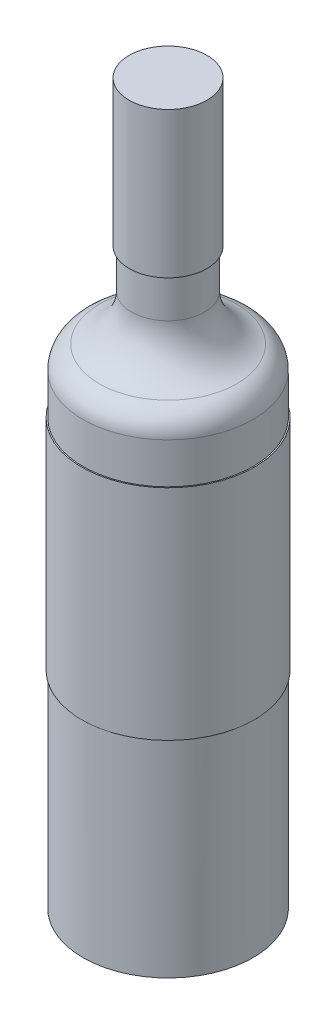
ISO-10303-21;
HEADER;
FILE_DESCRIPTION(('STEP AP214'),'2;1');
FILE_NAME('part.step','',(''),(''),'','','');
FILE_SCHEMA(('AUTOMOTIVE_DESIGN { 1 0 10303 214 1 1 1 1 }'));
ENDSEC;
DATA;
#1=APPLICATION_CONTEXT('core data for automotive mechanical design processes');
#2=APPLICATION_PROTOCOL_DEFINITION('international standard','automotive_design',2000,#1);
#3=PRODUCT_CONTEXT('',#1,'mechanical');
#4=PRODUCT('Part','Part','',(#3));
#5=PRODUCT_RELATED_PRODUCT_CATEGORY('part','',(#4));
#6=PRODUCT_DEFINITION_FORMATION('','',#4);
#7=PRODUCT_DEFINITION_CONTEXT('part definition',#1,'design');
#8=PRODUCT_DEFINITION('design','',#6,#7);
#9=PRODUCT_DEFINITION_SHAPE('','',#8);
#10=(LENGTH_UNIT() NAMED_UNIT(*) SI_UNIT(.MILLI.,.METRE.));
#11=(NAMED_UNIT(*) PLANE_ANGLE_UNIT() SI_UNIT($,.RADIAN.));
#12=(NAMED_UNIT(*) SI_UNIT($,.STERADIAN.) SOLID_ANGLE_UNIT());
#13=UNCERTAINTY_MEASURE_WITH_UNIT(LENGTH_MEASURE(1.E-05),#10,'distance_accuracy_value','');
#14=(GEOMETRIC_REPRESENTATION_CONTEXT(3) GLOBAL_UNCERTAINTY_ASSIGNED_CONTEXT((#13)) GLOBAL_UNIT_ASSIGNED_CONTEXT((#10,
#11,#12)) REPRESENTATION_CONTEXT('',''));
#15=CARTESIAN_POINT('',(0.,0.,0.));
#16=DIRECTION('',(0.,0.,1.));
#17=DIRECTION('',(1.,0.,0.));
#18=AXIS2_PLACEMENT_3D('',#15,#16,#17);
#19=CARTESIAN_POINT('',(0.,200.,0.));
#20=DIRECTION('',(0.,-1.,0.));
#21=DIRECTION('',(0.,0.,-1.));
#22=AXIS2_PLACEMENT_3D('',#19,#20,#21);
#23=CYLINDRICAL_SURFACE('',#22,35.);
#24=CARTESIAN_POINT('',(0.,191.715728752538,0.));
#25=DIRECTION('',(0.,-1.,0.));
#26=DIRECTION('',(0.,0.,-1.));
#27=AXIS2_PLACEMENT_3D('',#24,#25,#26);
#28=CIRCLE('',#27,35.);
#29=CARTESIAN_POINT('',(0.,191.715728752538,-35.));
#30=VERTEX_POINT('',#29);
#31=EDGE_CURVE('E42',#30,#30,#28,.T.);
#32=ORIENTED_EDGE('',*,*,#31,.T.);
#33=EDGE_LOOP('',(#32));
#34=FACE_BOUND('',#33,.T.);
#35=CARTESIAN_POINT('',(0.,175.,0.));
#36=DIRECTION('',(0.,-1.,0.));
#37=DIRECTION('',(0.,0.,-1.));
#38=AXIS2_PLACEMENT_3D('',#35,#36,#37);
#39=CIRCLE('',#38,35.);
#40=CARTESIAN_POINT('',(0.,175.,-35.));
#41=VERTEX_POINT('',#40);
#42=EDGE_CURVE('E10',#41,#41,#39,.T.);
#43=ORIENTED_EDGE('',*,*,#42,.F.);
#44=EDGE_LOOP('',(#43));
#45=FACE_BOUND('',#44,.T.);
#46=ADVANCED_FACE('F31',(#34,#45),#23,.T.);
#47=CARTESIAN_POINT('',(0.,295.,0.));
#48=DIRECTION('',(0.,-1.,0.));
#49=DIRECTION('',(0.,0.,-1.));
#50=AXIS2_PLACEMENT_3D('',#47,#48,#49);
#51=CYLINDRICAL_SURFACE('',#50,15.);
#52=CARTESIAN_POINT('',(0.,220.,0.));
#53=DIRECTION('',(0.,1.,0.));
#54=DIRECTION('',(0.,0.,1.));
#55=AXIS2_PLACEMENT_3D('',#52,#53,#54);
#56=CIRCLE('',#55,15.);
#57=CARTESIAN_POINT('',(0.,220.,15.));
#58=VERTEX_POINT('',#57);
#59=EDGE_CURVE('E72',#58,#58,#56,.T.);
#60=ORIENTED_EDGE('',*,*,#59,.T.);
#61=EDGE_LOOP('',(#60));
#62=FACE_BOUND('',#61,.T.);
#63=CARTESIAN_POINT('',(0.,236.,0.));
#64=DIRECTION('',(0.,1.,0.));
#65=DIRECTION('',(0.,0.,1.));
#66=AXIS2_PLACEMENT_3D('',#63,#64,#65);
#67=CIRCLE('',#66,15.);
#68=CARTESIAN_POINT('',(0.,236.,15.));
#69=VERTEX_POINT('',#68);
#70=EDGE_CURVE('E38',#69,#69,#67,.T.);
#71=ORIENTED_EDGE('',*,*,#70,.F.);
#72=EDGE_LOOP('',(#71));
#73=FACE_BOUND('',#72,.T.);
#74=ADVANCED_FACE('F90',(#62,#73),#51,.T.);
#75=CARTESIAN_POINT('',(0.,220.,0.));
#76=DIRECTION('',(0.,1.,0.));
#77=DIRECTION('',(0.,0.,1.));
#78=AXIS2_PLACEMENT_3D('',#75,#76,#77);
#79=TOROIDAL_SURFACE('',#78,35.,20.);
#80=CARTESIAN_POINT('',(0.,201.143819168359,0.));
#81=DIRECTION('',(0.,1.,0.));
#82=DIRECTION('',(0.,0.,1.));
#83=AXIS2_PLACEMENT_3D('',#80,#81,#82);
#84=CIRCLE('',#83,28.3333333333334);
#85=CARTESIAN_POINT('',(0.,201.143819168359,28.3333333333334));
#86=VERTEX_POINT('',#85);
#87=EDGE_CURVE('E47',#86,#86,#84,.T.);
#88=ORIENTED_EDGE('',*,*,#87,.T.);
#89=EDGE_LOOP('',(#88));
#90=FACE_BOUND('',#89,.T.);
#91=ORIENTED_EDGE('',*,*,#59,.F.);
#92=EDGE_LOOP('',(#91));
#93=FACE_BOUND('',#92,.T.);
#94=ADVANCED_FACE('F77',(#90,#93),#79,.F.);
#95=CARTESIAN_POINT('',(0.,191.715728752538,0.));
#96=DIRECTION('',(0.,-1.,0.));
#97=DIRECTION('',(0.,0.,-1.));
#98=AXIS2_PLACEMENT_3D('',#95,#96,#97);
#99=TOROIDAL_SURFACE('',#98,25.,10.);
#100=ORIENTED_EDGE('',*,*,#31,.F.);
#101=EDGE_LOOP('',(#100));
#102=FACE_BOUND('',#101,.T.);
#103=ORIENTED_EDGE('',*,*,#87,.F.);
#104=EDGE_LOOP('',(#103));
#105=FACE_BOUND('',#104,.T.);
#106=ADVANCED_FACE('F33',(#102,#105),#99,.T.);
#107=CARTESIAN_POINT('',(0.,236.,0.));
#108=DIRECTION('',(0.,1.,0.));
#109=DIRECTION('',(0.,0.,1.));
#110=AXIS2_PLACEMENT_3D('',#107,#108,#109);
#111=CYLINDRICAL_SURFACE('',#110,16.);
#112=CARTESIAN_POINT('',(0.,236.,0.));
#113=DIRECTION('',(0.,1.,0.));
#114=DIRECTION('',(0.,0.,1.));
#115=AXIS2_PLACEMENT_3D('',#112,#113,#114);
#116=CIRCLE('',#115,16.);
#117=CARTESIAN_POINT('',(0.,236.,16.));
#118=VERTEX_POINT('',#117);
#119=EDGE_CURVE('E57',#118,#118,#116,.T.);
#120=ORIENTED_EDGE('',*,*,#119,.T.);
#121=EDGE_LOOP('',(#120));
#122=FACE_BOUND('',#121,.T.);
#123=CARTESIAN_POINT('',(0.,296.,0.));
#124=DIRECTION('',(0.,1.,0.));
#125=DIRECTION('',(0.,0.,1.));
#126=AXIS2_PLACEMENT_3D('',#123,#124,#125);
#127=CIRCLE('',#126,16.);
#128=CARTESIAN_POINT('',(0.,296.,16.));
#129=VERTEX_POINT('',#128);
#130=EDGE_CURVE('E52',#129,#129,#127,.T.);
#131=ORIENTED_EDGE('',*,*,#130,.F.);
#132=EDGE_LOOP('',(#131));
#133=FACE_BOUND('',#132,.T.);
#134=ADVANCED_FACE('F81',(#122,#133),#111,.T.);
#135=CARTESIAN_POINT('',(0.,236.,0.));
#136=DIRECTION('',(0.,1.,0.));
#137=DIRECTION('',(0.,0.,1.));
#138=AXIS2_PLACEMENT_3D('',#135,#136,#137);
#139=PLANE('',#138);
#140=ORIENTED_EDGE('',*,*,#70,.T.);
#141=EDGE_LOOP('',(#140));
#142=FACE_BOUND('',#141,.T.);
#143=ORIENTED_EDGE('',*,*,#119,.F.);
#144=EDGE_LOOP('',(#143));
#145=FACE_BOUND('',#144,.T.);
#146=ADVANCED_FACE('F87',(#142,#145),#139,.F.);
#147=CARTESIAN_POINT('',(0.,296.,0.));
#148=DIRECTION('',(0.,1.,0.));
#149=DIRECTION('',(0.,0.,1.));
#150=AXIS2_PLACEMENT_3D('',#147,#148,#149);
#151=PLANE('',#150);
#152=ORIENTED_EDGE('',*,*,#130,.T.);
#153=EDGE_LOOP('',(#152));
#154=FACE_BOUND('',#153,.T.);
#155=ADVANCED_FACE('F119',(#154),#151,.T.);
#156=CARTESIAN_POINT('',(0.,175.,0.));
#157=DIRECTION('',(0.,-1.,0.));
#158=DIRECTION('',(0.,0.,-1.));
#159=AXIS2_PLACEMENT_3D('',#156,#157,#158);
#160=CYLINDRICAL_SURFACE('',#159,35.5);
#161=CARTESIAN_POINT('',(0.,175.,0.));
#162=DIRECTION('',(0.,-1.,0.));
#163=DIRECTION('',(0.,0.,-1.));
#164=AXIS2_PLACEMENT_3D('',#161,#162,#163);
#165=CIRCLE('',#164,35.5);
#166=CARTESIAN_POINT('',(0.,175.,-35.5));
#167=VERTEX_POINT('',#166);
#168=EDGE_CURVE('E53',#167,#167,#165,.T.);
#169=CARTESIAN_POINT('',(0.,85.,0.));
#170=DIRECTION('',(0.,-1.,0.));
#171=DIRECTION('',(0.,0.,-1.));
#172=AXIS2_PLACEMENT_3D('',#169,#170,#171);
#173=CIRCLE('',#172,35.5);
#174=CARTESIAN_POINT('',(0.,85.,-35.5));
#175=VERTEX_POINT('',#174);
#176=EDGE_CURVE('E60',#175,#175,#173,.T.);
#177=CARTESIAN_POINT('',(0.,175.,-35.5));
#178=CARTESIAN_POINT('',(0.,174.0625,-35.5));
#179=CARTESIAN_POINT('',(0.,173.125,-35.5));
#180=CARTESIAN_POINT('',(0.,171.25,-35.5));
#181=CARTESIAN_POINT('',(0.,170.3125,-35.5));
#182=CARTESIAN_POINT('',(0.,168.4375,-35.5));
#183=CARTESIAN_POINT('',(0.,167.5,-35.5));
#184=CARTESIAN_POINT('',(0.,165.625,-35.5));
#185=CARTESIAN_POINT('',(0.,164.6875,-35.5));
#186=CARTESIAN_POINT('',(0.,162.8125,-35.5));
#187=CARTESIAN_POINT('',(0.,161.875,-35.5));
#188=CARTESIAN_POINT('',(0.,160.,-35.5));
#189=CARTESIAN_POINT('',(0.,159.0625,-35.5));
#190=CARTESIAN_POINT('',(0.,157.1875,-35.5));
#191=CARTESIAN_POINT('',(0.,156.25,-35.5));
#192=CARTESIAN_POINT('',(0.,154.375,-35.5));
#193=CARTESIAN_POINT('',(0.,153.4375,-35.5));
#194=CARTESIAN_POINT('',(0.,151.5625,-35.5));
#195=CARTESIAN_POINT('',(0.,150.625,-35.5));
#196=CARTESIAN_POINT('',(0.,148.75,-35.5));
#197=CARTESIAN_POINT('',(0.,147.8125,-35.5));
#198=CARTESIAN_POINT('',(0.,145.9375,-35.5));
#199=CARTESIAN_POINT('',(0.,145.,-35.5));
#200=CARTESIAN_POINT('',(0.,143.125,-35.5));
#201=CARTESIAN_POINT('',(0.,142.1875,-35.5));
#202=CARTESIAN_POINT('',(0.,140.3125,-35.5));
#203=CARTESIAN_POINT('',(0.,139.375,-35.5));
#204=CARTESIAN_POINT('',(0.,137.5,-35.5));
#205=CARTESIAN_POINT('',(0.,136.5625,-35.5));
#206=CARTESIAN_POINT('',(0.,134.6875,-35.5));
#207=CARTESIAN_POINT('',(0.,133.75,-35.5));
#208=CARTESIAN_POINT('',(0.,131.875,-35.5));
#209=CARTESIAN_POINT('',(0.,130.9375,-35.5));
#210=CARTESIAN_POINT('',(0.,129.0625,-35.5));
#211=CARTESIAN_POINT('',(0.,128.125,-35.5));
#212=CARTESIAN_POINT('',(0.,126.25,-35.5));
#213=CARTESIAN_POINT('',(0.,125.3125,-35.5));
#214=CARTESIAN_POINT('',(0.,123.4375,-35.5));
#215=CARTESIAN_POINT('',(0.,122.5,-35.5));
#216=CARTESIAN_POINT('',(0.,120.625,-35.5));
#217=CARTESIAN_POINT('',(0.,119.6875,-35.5));
#218=CARTESIAN_POINT('',(0.,117.8125,-35.5));
#219=CARTESIAN_POINT('',(0.,116.875,-35.5));
#220=CARTESIAN_POINT('',(0.,115.,-35.5));
#221=CARTESIAN_POINT('',(0.,114.0625,-35.5));
#222=CARTESIAN_POINT('',(0.,112.1875,-35.5));
#223=CARTESIAN_POINT('',(0.,111.25,-35.5));
#224=CARTESIAN_POINT('',(0.,109.375,-35.5));
#225=CARTESIAN_POINT('',(0.,108.4375,-35.5));
#226=CARTESIAN_POINT('',(0.,106.5625,-35.5));
#227=CARTESIAN_POINT('',(0.,105.625,-35.5));
#228=CARTESIAN_POINT('',(0.,103.75,-35.5));
#229=CARTESIAN_POINT('',(0.,102.8125,-35.5));
#230=CARTESIAN_POINT('',(0.,100.9375,-35.5));
#231=CARTESIAN_POINT('',(0.,100.,-35.5));
#232=CARTESIAN_POINT('',(0.,98.125,-35.5));
#233=CARTESIAN_POINT('',(0.,97.1875,-35.5));
#234=CARTESIAN_POINT('',(0.,95.3125,-35.5));
#235=CARTESIAN_POINT('',(0.,94.375,-35.5));
#236=CARTESIAN_POINT('',(0.,92.5,-35.5));
#237=CARTESIAN_POINT('',(0.,91.5625,-35.5));
#238=CARTESIAN_POINT('',(0.,89.6875,-35.5));
#239=CARTESIAN_POINT('',(0.,88.75,-35.5));
#240=CARTESIAN_POINT('',(0.,86.875,-35.5));
#241=CARTESIAN_POINT('',(0.,85.9375,-35.5));
#242=CARTESIAN_POINT('',(0.,85.,-35.5));
#243=B_SPLINE_CURVE_WITH_KNOTS('',3,(#177,#178,#179,#180,#181,#182,#183,#184,#185,#186,#187,
#188,#189,#190,#191,#192,#193,#194,#195,#196,#197,#198,#199,#200,#201,#202,#203,#204,#205,#206,
#207,#208,#209,#210,#211,#212,#213,#214,#215,#216,#217,#218,#219,#220,#221,#222,#223,#224,#225,
#226,#227,#228,#229,#230,#231,#232,#233,#234,#235,#236,#237,#238,#239,#240,#241,#242),
.UNSPECIFIED.,.F.,.F.,(4,2,2,2,2,2,2,2,2,2,2,2,2,2,2,2,2,2,2,2,2,2,2,2,2,2,2,2,2,2,2,2,4),(0.,
2.81250000000002,5.62500000000002,8.43750000000001,11.25,14.0625,16.875,19.6875,22.5,25.3125,
28.125,30.9375,33.75,36.5625,39.375,42.1875,45.,47.8125,50.625,53.4375,56.25,59.0625,61.875,
64.6875,67.5,70.3125,73.125,75.9375,78.75,81.5625,84.375,87.1875,90.),.UNSPECIFIED.);
#244=EDGE_CURVE('BSEAM122',#167,#175,#243,.T.);
#245=ORIENTED_EDGE('',*,*,#168,.T.);
#246=ORIENTED_EDGE('',*,*,#176,.F.);
#247=ORIENTED_EDGE('',*,*,#244,.T.);
#248=ORIENTED_EDGE('',*,*,#244,.F.);
#249=EDGE_LOOP('',(#245,#247,#246,#248));
#250=FACE_BOUND('',#249,.T.);
#251=ADVANCED_FACE('F122',(#250),#160,.T.);
#252=CARTESIAN_POINT('',(0.,175.,0.));
#253=DIRECTION('',(0.,-1.,0.));
#254=DIRECTION('',(0.,0.,-1.));
#255=AXIS2_PLACEMENT_3D('',#252,#253,#254);
#256=PLANE('',#255);
#257=ORIENTED_EDGE('',*,*,#42,.T.);
#258=EDGE_LOOP('',(#257));
#259=FACE_BOUND('',#258,.T.);
#260=ORIENTED_EDGE('',*,*,#168,.F.);
#261=EDGE_LOOP('',(#260));
#262=FACE_BOUND('',#261,.T.);
#263=ADVANCED_FACE('F115',(#259,#262),#256,.F.);
#264=CARTESIAN_POINT('',(0.,85.,0.));
#265=DIRECTION('',(0.,-1.,0.));
#266=DIRECTION('',(0.,0.,-1.));
#267=AXIS2_PLACEMENT_3D('',#264,#265,#266);
#268=PLANE('',#267);
#269=CARTESIAN_POINT('',(0.,85.,0.));
#270=DIRECTION('',(0.,-1.,0.));
#271=DIRECTION('',(0.,0.,-1.));
#272=AXIS2_PLACEMENT_3D('',#269,#270,#271);
#273=CIRCLE('',#272,35.);
#274=CARTESIAN_POINT('',(0.,85.,-35.));
#275=VERTEX_POINT('',#274);
#276=EDGE_CURVE('E50',#275,#275,#273,.T.);
#277=ORIENTED_EDGE('',*,*,#276,.F.);
#278=EDGE_LOOP('',(#277));
#279=FACE_BOUND('',#278,.T.);
#280=ORIENTED_EDGE('',*,*,#176,.T.);
#281=EDGE_LOOP('',(#280));
#282=FACE_BOUND('',#281,.T.);
#283=ADVANCED_FACE('F108',(#279,#282),#268,.T.);
#284=CARTESIAN_POINT('',(0.,0.,0.));
#285=DIRECTION('',(0.,1.,0.));
#286=DIRECTION('',(0.,0.,1.));
#287=AXIS2_PLACEMENT_3D('',#284,#285,#286);
#288=PLANE('',#287);
#289=CARTESIAN_POINT('',(0.,0.,0.));
#290=DIRECTION('',(0.,1.,0.));
#291=DIRECTION('',(0.,0.,1.));
#292=AXIS2_PLACEMENT_3D('',#289,#290,#291);
#293=CIRCLE('',#292,35.);
#294=CARTESIAN_POINT('',(0.,0.,35.));
#295=VERTEX_POINT('',#294);
#296=EDGE_CURVE('E68',#295,#295,#293,.T.);
#297=ORIENTED_EDGE('',*,*,#296,.F.);
#298=EDGE_LOOP('',(#297));
#299=FACE_BOUND('',#298,.T.);
#300=ADVANCED_FACE('F104',(#299),#288,.F.);
#301=ORIENTED_EDGE('',*,*,#276,.T.);
#302=EDGE_LOOP('',(#301));
#303=FACE_BOUND('',#302,.T.);
#304=ORIENTED_EDGE('',*,*,#296,.T.);
#305=EDGE_LOOP('',(#304));
#306=FACE_BOUND('',#305,.T.);
#307=ADVANCED_FACE('F95',(#303,#306),#23,.T.);
#308=CLOSED_SHELL('',(#46,#74,#94,#106,#134,#146,#155,#251,#263,#283,#300,#307));
#309=MANIFOLD_SOLID_BREP('B2',#308);
#310=ADVANCED_BREP_SHAPE_REPRESENTATION('',(#18,#309),#14);
#311=SHAPE_DEFINITION_REPRESENTATION(#9,#310);
ENDSEC;
END-ISO-10303-21;
